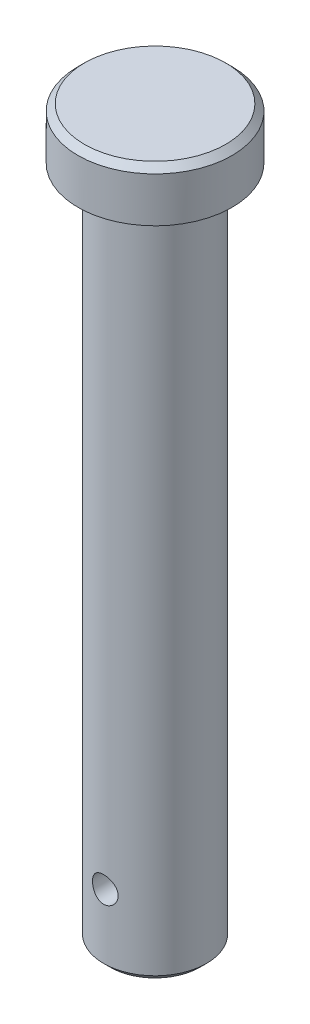
ISO-10303-21;
HEADER;
FILE_DESCRIPTION(('STEP AP214'),'2;1');
FILE_NAME('part.step','',(''),(''),'','','');
FILE_SCHEMA(('AUTOMOTIVE_DESIGN { 1 0 10303 214 1 1 1 1 }'));
ENDSEC;
DATA;
#1=APPLICATION_CONTEXT('core data for automotive mechanical design processes');
#2=APPLICATION_PROTOCOL_DEFINITION('international standard','automotive_design',2000,#1);
#3=PRODUCT_CONTEXT('',#1,'mechanical');
#4=PRODUCT('Part','Part','',(#3));
#5=PRODUCT_RELATED_PRODUCT_CATEGORY('part','',(#4));
#6=PRODUCT_DEFINITION_FORMATION('','',#4);
#7=PRODUCT_DEFINITION_CONTEXT('part definition',#1,'design');
#8=PRODUCT_DEFINITION('design','',#6,#7);
#9=PRODUCT_DEFINITION_SHAPE('','',#8);
#10=(LENGTH_UNIT() NAMED_UNIT(*) SI_UNIT(.MILLI.,.METRE.));
#11=(NAMED_UNIT(*) PLANE_ANGLE_UNIT() SI_UNIT($,.RADIAN.));
#12=(NAMED_UNIT(*) SI_UNIT($,.STERADIAN.) SOLID_ANGLE_UNIT());
#13=UNCERTAINTY_MEASURE_WITH_UNIT(LENGTH_MEASURE(1.E-05),#10,'distance_accuracy_value','');
#14=(GEOMETRIC_REPRESENTATION_CONTEXT(3) GLOBAL_UNCERTAINTY_ASSIGNED_CONTEXT((#13)) GLOBAL_UNIT_ASSIGNED_CONTEXT((#10,
#11,#12)) REPRESENTATION_CONTEXT('',''));
#15=CARTESIAN_POINT('',(0.,0.,0.));
#16=DIRECTION('',(0.,0.,1.));
#17=DIRECTION('',(1.,0.,0.));
#18=AXIS2_PLACEMENT_3D('',#15,#16,#17);
#19=CARTESIAN_POINT('',(0.,56.5,0.));
#20=DIRECTION('',(0.,1.,0.));
#21=DIRECTION('',(0.,0.,1.));
#22=AXIS2_PLACEMENT_3D('',#19,#20,#21);
#23=PLANE('',#22);
#24=CARTESIAN_POINT('',(0.,56.5,0.));
#25=DIRECTION('',(0.,1.,0.));
#26=DIRECTION('',(0.,0.,1.));
#27=AXIS2_PLACEMENT_3D('',#24,#25,#26);
#28=CIRCLE('',#27,11.);
#29=CARTESIAN_POINT('',(0.,56.5,11.));
#30=VERTEX_POINT('',#29);
#31=EDGE_CURVE('E48',#30,#30,#28,.T.);
#32=ORIENTED_EDGE('',*,*,#31,.T.);
#33=EDGE_LOOP('',(#32));
#34=FACE_BOUND('',#33,.T.);
#35=ADVANCED_FACE('F31',(#34),#23,.T.);
#36=CARTESIAN_POINT('',(0.,-56.5,0.));
#37=DIRECTION('',(0.,-1.,0.));
#38=DIRECTION('',(0.,0.,-1.));
#39=AXIS2_PLACEMENT_3D('',#36,#37,#38);
#40=CYLINDRICAL_SURFACE('',#39,12.);
#41=CARTESIAN_POINT('',(0.,55.5,0.));
#42=DIRECTION('',(0.,1.,0.));
#43=DIRECTION('',(0.,0.,1.));
#44=AXIS2_PLACEMENT_3D('',#41,#42,#43);
#45=CIRCLE('',#44,12.);
#46=CARTESIAN_POINT('',(0.,55.5,12.));
#47=VERTEX_POINT('',#46);
#48=EDGE_CURVE('E98',#47,#47,#45,.F.);
#49=ORIENTED_EDGE('',*,*,#48,.T.);
#50=EDGE_LOOP('',(#49));
#51=FACE_BOUND('',#50,.T.);
#52=CARTESIAN_POINT('',(0.,48.5,0.));
#53=DIRECTION('',(0.,-1.,0.));
#54=DIRECTION('',(0.,0.,-1.));
#55=AXIS2_PLACEMENT_3D('',#52,#53,#54);
#56=CIRCLE('',#55,12.);
#57=CARTESIAN_POINT('',(0.,48.5,-12.));
#58=VERTEX_POINT('',#57);
#59=EDGE_CURVE('E92',#58,#58,#56,.T.);
#60=ORIENTED_EDGE('',*,*,#59,.F.);
#61=EDGE_LOOP('',(#60));
#62=FACE_BOUND('',#61,.T.);
#63=ADVANCED_FACE('F76',(#51,#62),#40,.T.);
#64=CARTESIAN_POINT('',(12.,48.5,0.));
#65=DIRECTION('',(0.,-1.,0.));
#66=DIRECTION('',(0.,0.,-1.));
#67=AXIS2_PLACEMENT_3D('',#64,#65,#66);
#68=PLANE('',#67);
#69=ORIENTED_EDGE('',*,*,#59,.T.);
#70=EDGE_LOOP('',(#69));
#71=FACE_BOUND('',#70,.T.);
#72=CARTESIAN_POINT('',(0.,48.5,0.));
#73=DIRECTION('',(0.,-1.,0.));
#74=DIRECTION('',(0.,0.,-1.));
#75=AXIS2_PLACEMENT_3D('',#72,#73,#74);
#76=CIRCLE('',#75,7.99999999999998);
#77=CARTESIAN_POINT('',(0.,48.5,-7.99999999999998));
#78=VERTEX_POINT('',#77);
#79=EDGE_CURVE('E95',#78,#78,#76,.T.);
#80=ORIENTED_EDGE('',*,*,#79,.F.);
#81=EDGE_LOOP('',(#80));
#82=FACE_BOUND('',#81,.T.);
#83=ADVANCED_FACE('F73',(#71,#82),#68,.T.);
#84=CARTESIAN_POINT('',(0.,-56.5,0.));
#85=DIRECTION('',(0.,-1.,0.));
#86=DIRECTION('',(0.,0.,-1.));
#87=AXIS2_PLACEMENT_3D('',#84,#85,#86);
#88=CYLINDRICAL_SURFACE('',#87,7.99999999999998);
#89=CARTESIAN_POINT('',(0.,-43.5,-7.99999999999998));
#90=CARTESIAN_POINT('',(0.110501451559641,-43.5000031009842,-7.99999813157348));
#91=CARTESIAN_POINT('',(0.221037543774351,-43.509188734365,-7.99768770842433));
#92=CARTESIAN_POINT('',(0.438941765027377,-43.545633535076,-7.98869485106524));
#93=CARTESIAN_POINT('',(0.54630806249432,-43.5729029460505,-7.98200993893299));
#94=CARTESIAN_POINT('',(0.754694496243437,-43.6445856712828,-7.96500835109374));
#95=CARTESIAN_POINT('',(0.855722084573336,-43.688978398287,-7.95469603789409));
#96=CARTESIAN_POINT('',(1.04889617587257,-43.7935751867264,-7.93153791743493));
#97=CARTESIAN_POINT('',(1.14104237913169,-43.8537797814919,-7.91869202472207));
#98=CARTESIAN_POINT('',(1.31573590306789,-43.9896010528722,-7.89156551455589));
#99=CARTESIAN_POINT('',(1.39807425341474,-44.0654820999454,-7.877262761975));
#100=CARTESIAN_POINT('',(1.54899856960443,-44.229936273212,-7.84898160157246));
#101=CARTESIAN_POINT('',(1.61758298259893,-44.3185108305959,-7.83500323053155));
#102=CARTESIAN_POINT('',(1.74003539039864,-44.507460302316,-7.80873034264223));
#103=CARTESIAN_POINT('',(1.79366962123353,-44.6079909744116,-7.79646392619746));
#104=CARTESIAN_POINT('',(1.88319587806767,-44.8169978822134,-7.77532659757353));
#105=CARTESIAN_POINT('',(1.91909074058686,-44.9254728444427,-7.76645514259222));
#106=CARTESIAN_POINT('',(1.97140644907303,-45.1449913309355,-7.75333968928428));
#107=CARTESIAN_POINT('',(1.98820302444275,-45.255939861384,-7.74900654662679));
#108=CARTESIAN_POINT('',(2.00301570008856,-45.4791580919991,-7.7451914994612));
#109=CARTESIAN_POINT('',(2.00103485575749,-45.5914275742562,-7.74570880570569));
#110=CARTESIAN_POINT('',(1.97864869951962,-45.8112210769938,-7.75145607355754));
#111=CARTESIAN_POINT('',(1.95869112025419,-45.9187941619538,-7.75657150676389));
#112=CARTESIAN_POINT('',(1.90163224920401,-46.1290147345481,-7.77075612894756));
#113=CARTESIAN_POINT('',(1.86452973609254,-46.2316618707052,-7.77982559958982));
#114=CARTESIAN_POINT('',(1.7738526372496,-46.4303173550028,-7.8010015187421));
#115=CARTESIAN_POINT('',(1.72011555631058,-46.5262482290527,-7.81313769959752));
#116=CARTESIAN_POINT('',(1.59780836801995,-46.7078916130091,-7.83906281127986));
#117=CARTESIAN_POINT('',(1.52923566507847,-46.7936023307563,-7.85285203112835));
#118=CARTESIAN_POINT('',(1.37688456624165,-46.9549381542592,-7.88101174053186));
#119=CARTESIAN_POINT('',(1.29272834422117,-47.0302059867485,-7.89538759303999));
#120=CARTESIAN_POINT('',(1.11281589000496,-47.1656283232852,-7.92274620771673));
#121=CARTESIAN_POINT('',(1.01705930361062,-47.2257823656847,-7.93572892732541));
#122=CARTESIAN_POINT('',(0.81615451824188,-47.3294007816325,-7.95890309458918));
#123=CARTESIAN_POINT('',(0.710975190944854,-47.3728071203392,-7.96908480170301));
#124=CARTESIAN_POINT('',(0.494501344190532,-47.4412230742794,-7.98543889321886));
#125=CARTESIAN_POINT('',(0.383207998867335,-47.4662362085575,-7.99161204452372));
#126=CARTESIAN_POINT('',(0.160719960520057,-47.4966100874118,-7.99913999028498));
#127=CARTESIAN_POINT('',(0.0495956266509674,-47.5024573681004,-8.00061404677703));
#128=CARTESIAN_POINT('',(-0.172043833068656,-47.4956679972593,-7.99891739752599));
#129=CARTESIAN_POINT('',(-0.282559012859439,-47.4830330096012,-7.99574710989127));
#130=CARTESIAN_POINT('',(-0.498152358368635,-47.4400387888115,-7.98519441503141));
#131=CARTESIAN_POINT('',(-0.603286825291652,-47.4099449820307,-7.97787512247747));
#132=CARTESIAN_POINT('',(-0.807009723269995,-47.3331905546287,-7.95984942178844));
#133=CARTESIAN_POINT('',(-0.905597492043494,-47.2865282609158,-7.94914267159854));
#134=CARTESIAN_POINT('',(-1.09536417923978,-47.1770184948337,-7.92524410568412));
#135=CARTESIAN_POINT('',(-1.18638058911442,-47.1138985168043,-7.91201156489241));
#136=CARTESIAN_POINT('',(-1.35670215152431,-46.9736134549374,-7.88459345583224));
#137=CARTESIAN_POINT('',(-1.43600527863066,-46.8964459471775,-7.87040772335605));
#138=CARTESIAN_POINT('',(-1.58265409076362,-46.7279973855407,-7.84225275947693));
#139=CARTESIAN_POINT('',(-1.64965849016269,-46.6364163959968,-7.82829738916373));
#140=CARTESIAN_POINT('',(-1.76734767868358,-46.4430231540457,-7.8025717116965));
#141=CARTESIAN_POINT('',(-1.81803319221057,-46.3412113560537,-7.79080130756033));
#142=CARTESIAN_POINT('',(-1.90126856081238,-46.1307923701159,-7.77090792979552));
#143=CARTESIAN_POINT('',(-1.93392586220541,-46.0222298288747,-7.76276340389206));
#144=CARTESIAN_POINT('',(-1.98046087993836,-45.8009204828145,-7.75102325453576));
#145=CARTESIAN_POINT('',(-1.99434270330486,-45.6881745986233,-7.7474266362658));
#146=CARTESIAN_POINT('',(-2.00271812044531,-45.4651719681931,-7.74526534938607));
#147=CARTESIAN_POINT('',(-1.99775719704015,-45.354936753167,-7.7465591030435));
#148=CARTESIAN_POINT('',(-1.96983637108381,-45.1369281484427,-7.75370545343789));
#149=CARTESIAN_POINT('',(-1.94687683024902,-45.0291547093151,-7.75955795855807));
#150=CARTESIAN_POINT('',(-1.88390842592372,-44.8197220545795,-7.77508347576961));
#151=CARTESIAN_POINT('',(-1.84400187290716,-44.7180302596797,-7.78473353648411));
#152=CARTESIAN_POINT('',(-1.74835321814009,-44.5227128230484,-7.80677007633103));
#153=CARTESIAN_POINT('',(-1.69260892004558,-44.4290883024174,-7.81915693494362));
#154=CARTESIAN_POINT('',(-1.56515699818284,-44.2499271613306,-7.84567512351348));
#155=CARTESIAN_POINT('',(-1.493070883883,-44.1646652354347,-7.85984353109008));
#156=CARTESIAN_POINT('',(-1.33571916158631,-44.0072706069395,-7.88810702995046));
#157=CARTESIAN_POINT('',(-1.25045042834819,-43.935141026516,-7.90220210302744));
#158=CARTESIAN_POINT('',(-1.06729011560345,-43.8047849219139,-7.92903540863549));
#159=CARTESIAN_POINT('',(-0.969197896421849,-43.7468338484379,-7.94174444487822));
#160=CARTESIAN_POINT('',(-0.764354746013969,-43.6483367160793,-7.96406566633489));
#161=CARTESIAN_POINT('',(-0.657610084582317,-43.6077781858019,-7.9736800693304));
#162=CARTESIAN_POINT('',(-0.459213670991291,-43.5512375595605,-7.98730746087387));
#163=CARTESIAN_POINT('',(-0.368506894544087,-43.5320650092621,-7.99203446736919));
#164=CARTESIAN_POINT('',(-0.185208095381708,-43.5064454085041,-7.99838140309263));
#165=CARTESIAN_POINT('',(-0.0926162149901537,-43.4999974009263,-8.00000156601191));
#166=CARTESIAN_POINT('',(0.,-43.5,-7.99999999999998));
#167=B_SPLINE_CURVE_WITH_KNOTS('',3,(#89,#90,#91,#92,#93,#94,#95,#96,#97,#98,#99,#100,#101,#102,
#103,#104,#105,#106,#107,#108,#109,#110,#111,#112,#113,#114,#115,#116,#117,#118,#119,#120,#121,
#122,#123,#124,#125,#126,#127,#128,#129,#130,#131,#132,#133,#134,#135,#136,#137,#138,#139,#140,
#141,#142,#143,#144,#145,#146,#147,#148,#149,#150,#151,#152,#153,#154,#155,#156,#157,#158,#159,
#160,#161,#162,#163,#164,#165,#166),.UNSPECIFIED.,.T.,.F.,(4,2,2,2,2,2,2,2,2,2,2,2,2,2,2,2,2,2,
2,2,2,2,2,2,2,2,2,2,2,2,2,2,2,2,2,2,2,2,4),(0.,0.33116494996252,0.662517650351867,
0.993473203048141,1.32443992022577,1.66152580582852,1.99864972773415,2.34078196727742,
2.68285948225825,3.01808393468094,3.3532538415469,3.68029996013785,4.00736937959146,
4.337740371696,4.66816921119311,5.00802001296453,5.34788119415424,5.6889097201658,
6.02987298255952,6.36211078603463,6.69431868154752,7.02160366023145,7.34892169767482,
7.68204783424897,8.01523150681786,8.35659345610395,8.69794025003773,9.03723006156477,
9.37644564340972,9.70591707202578,10.0353818794581,10.3628853408369,10.6904342418696,
11.0265276855097,11.3627009303165,11.7049624733721,12.0469781843289,12.3245632392729,
12.6021274139515),.UNSPECIFIED.);
#168=CARTESIAN_POINT('',(0.,-43.5,-7.99999999999998));
#169=VERTEX_POINT('',#168);
#170=EDGE_CURVE('E35',#169,#169,#167,.T.);
#171=ORIENTED_EDGE('',*,*,#170,.F.);
#172=EDGE_LOOP('',(#171));
#173=FACE_BOUND('',#172,.T.);
#174=CARTESIAN_POINT('',(2.00000000000001,-45.5,7.74596669241481));
#175=CARTESIAN_POINT('',(1.99999686287447,-45.3895593992587,7.74596880070286));
#176=CARTESIAN_POINT('',(1.99082099639813,-45.2790840810572,7.74835444811676));
#177=CARTESIAN_POINT('',(1.95441850037105,-45.0613059374612,7.75761489594049));
#178=CARTESIAN_POINT('',(1.92718136539369,-44.9540049964254,7.76449230897302));
#179=CARTESIAN_POINT('',(1.85559295970564,-44.7457571694502,7.78190979676918));
#180=CARTESIAN_POINT('',(1.8112637822836,-44.6448022756914,7.79244514152364));
#181=CARTESIAN_POINT('',(1.70681691300912,-44.4517513179681,7.81598553623005));
#182=CARTESIAN_POINT('',(1.64669855084856,-44.3596556303358,7.82899069102789));
#183=CARTESIAN_POINT('',(1.51096674184952,-44.1849106837902,7.85632573084498));
#184=CARTESIAN_POINT('',(1.43506951016325,-44.10248511972,7.87067678098425));
#185=CARTESIAN_POINT('',(1.27054565128054,-43.9513908845117,7.89890300412233));
#186=CARTESIAN_POINT('',(1.18191783534425,-43.8827234995026,7.91277813253109));
#187=CARTESIAN_POINT('',(0.992916160863173,-43.760179625895,7.93872332416464));
#188=CARTESIAN_POINT('',(0.892395660956103,-43.7065228894708,7.95076549920472));
#189=CARTESIAN_POINT('',(0.683410547434216,-43.6169522846775,7.97144649540785));
#190=CARTESIAN_POINT('',(0.574947108633559,-43.5810357984676,7.98008581867473));
#191=CARTESIAN_POINT('',(0.355487007003337,-43.5286817323371,7.99283807078542));
#192=CARTESIAN_POINT('',(0.244586175639189,-43.5118642845387,7.99703915075449));
#193=CARTESIAN_POINT('',(0.021463055410225,-43.4969932965796,8.00074875285836));
#194=CARTESIAN_POINT('',(-0.0907590356304449,-43.4989369822323,8.00025796877361));
#195=CARTESIAN_POINT('',(-0.310704494344763,-43.5212598802001,7.99470475962826));
#196=CARTESIAN_POINT('',(-0.418472431202121,-43.5412290600431,7.98974401872697));
#197=CARTESIAN_POINT('',(-0.62907649482736,-43.5983770160388,7.97592669219881));
#198=CARTESIAN_POINT('',(-0.731912358740865,-43.6355567083019,7.96706989918751));
#199=CARTESIAN_POINT('',(-0.930813407003603,-43.7264020565496,7.94630007760715));
#200=CARTESIAN_POINT('',(-1.026809019533,-43.7802136357294,7.93436015756041));
#201=CARTESIAN_POINT('',(-1.20855124468097,-43.902684543293,7.90871923047718));
#202=CARTESIAN_POINT('',(-1.294296070171,-43.9713464548485,7.8950179172199));
#203=CARTESIAN_POINT('',(-1.4555480701699,-44.1237669935859,7.86690971015614));
#204=CARTESIAN_POINT('',(-1.53071535815039,-44.2078839138782,7.85249375620732));
#205=CARTESIAN_POINT('',(-1.66595275192603,-44.3876799788322,7.82492034813364));
#206=CARTESIAN_POINT('',(-1.72602215209202,-44.4833596635928,7.81176295284775));
#207=CARTESIAN_POINT('',(-1.82957625804518,-44.6842320273192,7.78816397465317));
#208=CARTESIAN_POINT('',(-1.87297913394097,-44.7894685842506,7.77773586980575));
#209=CARTESIAN_POINT('',(-1.94137124127267,-45.0060683744612,7.76094912111964));
#210=CARTESIAN_POINT('',(-1.96636441310581,-45.1174302911865,7.75458960648173));
#211=CARTESIAN_POINT('',(-1.99666371093213,-45.3399676012185,7.74684284831311));
#212=CARTESIAN_POINT('',(-2.00247237913569,-45.4510702346637,7.74532871274917));
#213=CARTESIAN_POINT('',(-1.99561359241243,-45.6726575492625,7.7470987478483));
#214=CARTESIAN_POINT('',(-1.98294783827903,-45.783142286361,7.75038247681011));
#215=CARTESIAN_POINT('',(-1.93994037115012,-45.9984914119638,7.76125665563647));
#216=CARTESIAN_POINT('',(-1.90989125462539,-46.1034181812567,7.76877576187498));
#217=CARTESIAN_POINT('',(-1.83329446533649,-46.3067451662813,7.78720574616768));
#218=CARTESIAN_POINT('',(-1.78674483817003,-46.4051446072443,7.79811702598889));
#219=CARTESIAN_POINT('',(-1.67741653434924,-46.5947530222939,7.82236909674608));
#220=CARTESIAN_POINT('',(-1.61433740306849,-46.6857830720345,7.83575334885312));
#221=CARTESIAN_POINT('',(-1.4741205858689,-46.8561506902411,7.86333666457371));
#222=CARTESIAN_POINT('',(-1.39698058961087,-46.93548633332,7.87753586182775));
#223=CARTESIAN_POINT('',(-1.22852544196944,-47.0822488340568,7.90557922425283));
#224=CARTESIAN_POINT('',(-1.13690390506317,-47.149328050039,7.91940561649467));
#225=CARTESIAN_POINT('',(-0.943405365389339,-47.267148693561,7.94477773290986));
#226=CARTESIAN_POINT('',(-0.841528897915171,-47.3178909732866,7.95632357603167));
#227=CARTESIAN_POINT('',(-0.631116403462171,-47.4011568276223,7.97576092590648));
#228=CARTESIAN_POINT('',(-0.522634762055754,-47.4338114275032,7.98367864017923));
#229=CARTESIAN_POINT('',(-0.301499520637603,-47.4803682676867,7.99508234716632));
#230=CARTESIAN_POINT('',(-0.18884673008247,-47.4942741269912,7.99856919514736));
#231=CARTESIAN_POINT('',(0.0341670528866581,-47.5027351791511,8.0006833881761));
#232=CARTESIAN_POINT('',(0.144507653932056,-47.4978034181908,7.99943957759975));
#233=CARTESIAN_POINT('',(0.362734992829514,-47.4699043454113,7.99251792914885));
#234=CARTESIAN_POINT('',(0.470621803561869,-47.4469375699737,7.98684022314336));
#235=CARTESIAN_POINT('',(0.68034207128956,-47.3838955604583,7.97170865707776));
#236=CARTESIAN_POINT('',(0.782204989161737,-47.3439130933712,7.96227529004783));
#237=CARTESIAN_POINT('',(0.97783410608326,-47.2480588419608,7.94062577827314));
#238=CARTESIAN_POINT('',(1.07159928253128,-47.192185054659,7.92840928277513));
#239=CARTESIAN_POINT('',(1.25080385684662,-47.0645695320077,7.90214499360572));
#240=CARTESIAN_POINT('',(1.33598997659668,-46.9924797141923,7.88806033883327));
#241=CARTESIAN_POINT('',(1.49323004054702,-46.8351542960453,7.85981298114377));
#242=CARTESIAN_POINT('',(1.56528065015319,-46.7499153677777,7.84565025934602));
#243=CARTESIAN_POINT('',(1.69552405294368,-46.5667971716211,7.81854951691003));
#244=CARTESIAN_POINT('',(1.75343323883277,-46.4687117532695,7.80563927346575));
#245=CARTESIAN_POINT('',(1.85185379317095,-46.2638890202504,7.78287910989654));
#246=CARTESIAN_POINT('',(1.89237781950432,-46.1571580678123,7.77302696466425));
#247=CARTESIAN_POINT('',(1.94884505714202,-45.9588459763297,7.75903817501472));
#248=CARTESIAN_POINT('',(1.96798634119377,-45.8682136712277,7.75417326006996));
#249=CARTESIAN_POINT('',(1.99356458514355,-45.6850622620046,7.74763677165238));
#250=CARTESIAN_POINT('',(2.00000262874351,-45.5925433195112,7.74596492578213));
#251=CARTESIAN_POINT('',(2.00000000000001,-45.5,7.74596669241481));
#252=B_SPLINE_CURVE_WITH_KNOTS('',3,(#174,#175,#176,#177,#178,#179,#180,#181,#182,#183,#184,
#185,#186,#187,#188,#189,#190,#191,#192,#193,#194,#195,#196,#197,#198,#199,#200,#201,#202,#203,
#204,#205,#206,#207,#208,#209,#210,#211,#212,#213,#214,#215,#216,#217,#218,#219,#220,#221,#222,
#223,#224,#225,#226,#227,#228,#229,#230,#231,#232,#233,#234,#235,#236,#237,#238,#239,#240,#241,
#242,#243,#244,#245,#246,#247,#248,#249,#250,#251),.UNSPECIFIED.,.T.,.F.,(4,2,2,2,2,2,2,2,2,2,2,
2,2,2,2,2,2,2,2,2,2,2,2,2,2,2,2,2,2,2,2,2,2,2,2,2,2,2,4),(0.,0.330981953388917,
0.662156593142934,0.992904581732817,1.32366661404383,1.66099163354382,1.99834817183894,
2.34041197118337,2.68242527877674,3.01751000796278,3.35254518932817,3.68014610151158,
4.00776445379829,4.33834299403556,4.66897908375131,5.0085637325753,5.34816424959842,
5.68941145606723,6.03058560103638,6.36274859809375,6.69488101747043,7.02157924007366,
7.34831617137134,7.68146276687326,8.01466415108036,8.35620264772255,8.69772332575643,
9.03673658245544,9.37568439127231,9.70546756901966,10.0352409390159,10.3632390124777,
10.6912784459046,11.0271767726566,11.3631602525241,11.7054118182895,12.0474137709606,
12.3247826174462,12.6021278008238),.UNSPECIFIED.);
#253=CARTESIAN_POINT('',(2.00000000000001,-45.5,7.74596669241481));
#254=VERTEX_POINT('',#253);
#255=EDGE_CURVE('E51',#254,#254,#252,.T.);
#256=ORIENTED_EDGE('',*,*,#255,.F.);
#257=EDGE_LOOP('',(#256));
#258=FACE_BOUND('',#257,.T.);
#259=CARTESIAN_POINT('',(0.,-55.5,0.));
#260=DIRECTION('',(0.,-1.,0.));
#261=DIRECTION('',(0.,0.,-1.));
#262=AXIS2_PLACEMENT_3D('',#259,#260,#261);
#263=CIRCLE('',#262,7.99999999999998);
#264=CARTESIAN_POINT('',(0.,-55.5,-7.99999999999998));
#265=VERTEX_POINT('',#264);
#266=EDGE_CURVE('E10',#265,#265,#263,.F.);
#267=ORIENTED_EDGE('',*,*,#266,.T.);
#268=EDGE_LOOP('',(#267));
#269=FACE_BOUND('',#268,.T.);
#270=ORIENTED_EDGE('',*,*,#79,.T.);
#271=EDGE_LOOP('',(#270));
#272=FACE_BOUND('',#271,.T.);
#273=ADVANCED_FACE('F55',(#173,#258,#269,#272),#88,.T.);
#274=CARTESIAN_POINT('',(7.99999999999998,-56.5,0.));
#275=DIRECTION('',(0.,-1.,0.));
#276=DIRECTION('',(0.,0.,-1.));
#277=AXIS2_PLACEMENT_3D('',#274,#275,#276);
#278=PLANE('',#277);
#279=CARTESIAN_POINT('',(0.,-56.5,0.));
#280=DIRECTION('',(0.,-1.,0.));
#281=DIRECTION('',(0.,0.,-1.));
#282=AXIS2_PLACEMENT_3D('',#279,#280,#281);
#283=CIRCLE('',#282,6.99999999999999);
#284=CARTESIAN_POINT('',(0.,-56.5,-6.99999999999999));
#285=VERTEX_POINT('',#284);
#286=EDGE_CURVE('E43',#285,#285,#283,.T.);
#287=ORIENTED_EDGE('',*,*,#286,.T.);
#288=EDGE_LOOP('',(#287));
#289=FACE_BOUND('',#288,.T.);
#290=ADVANCED_FACE('F63',(#289),#278,.T.);
#291=CARTESIAN_POINT('',(0.,55.5,0.));
#292=DIRECTION('',(0.,-1.,0.));
#293=DIRECTION('',(0.,0.,-1.));
#294=AXIS2_PLACEMENT_3D('',#291,#292,#293);
#295=CONICAL_SURFACE('',#294,12.,0.785398163397453);
#296=ORIENTED_EDGE('',*,*,#31,.F.);
#297=EDGE_LOOP('',(#296));
#298=FACE_BOUND('',#297,.T.);
#299=ORIENTED_EDGE('',*,*,#48,.F.);
#300=EDGE_LOOP('',(#299));
#301=FACE_BOUND('',#300,.T.);
#302=ADVANCED_FACE('F66',(#298,#301),#295,.T.);
#303=CARTESIAN_POINT('',(0.,-56.5,0.));
#304=DIRECTION('',(0.,1.,0.));
#305=DIRECTION('',(0.,0.,1.));
#306=AXIS2_PLACEMENT_3D('',#303,#304,#305);
#307=CONICAL_SURFACE('',#306,6.99999999999999,0.785398163397453);
#308=ORIENTED_EDGE('',*,*,#266,.F.);
#309=EDGE_LOOP('',(#308));
#310=FACE_BOUND('',#309,.T.);
#311=ORIENTED_EDGE('',*,*,#286,.F.);
#312=EDGE_LOOP('',(#311));
#313=FACE_BOUND('',#312,.T.);
#314=ADVANCED_FACE('F33',(#310,#313),#307,.T.);
#315=CARTESIAN_POINT('',(0.,-45.5,-25.));
#316=DIRECTION('',(0.,0.,1.));
#317=DIRECTION('',(1.,0.,0.));
#318=AXIS2_PLACEMENT_3D('',#315,#316,#317);
#319=CYLINDRICAL_SURFACE('',#318,2.);
#320=ORIENTED_EDGE('',*,*,#170,.T.);
#321=EDGE_LOOP('',(#320));
#322=FACE_BOUND('',#321,.T.);
#323=ORIENTED_EDGE('',*,*,#255,.T.);
#324=EDGE_LOOP('',(#323));
#325=FACE_BOUND('',#324,.T.);
#326=ADVANCED_FACE('F59',(#322,#325),#319,.F.);
#327=CLOSED_SHELL('',(#35,#63,#83,#273,#290,#302,#314,#326));
#328=MANIFOLD_SOLID_BREP('B2',#327);
#329=ADVANCED_BREP_SHAPE_REPRESENTATION('',(#18,#328),#14);
#330=SHAPE_DEFINITION_REPRESENTATION(#9,#329);
ENDSEC;
END-ISO-10303-21;
